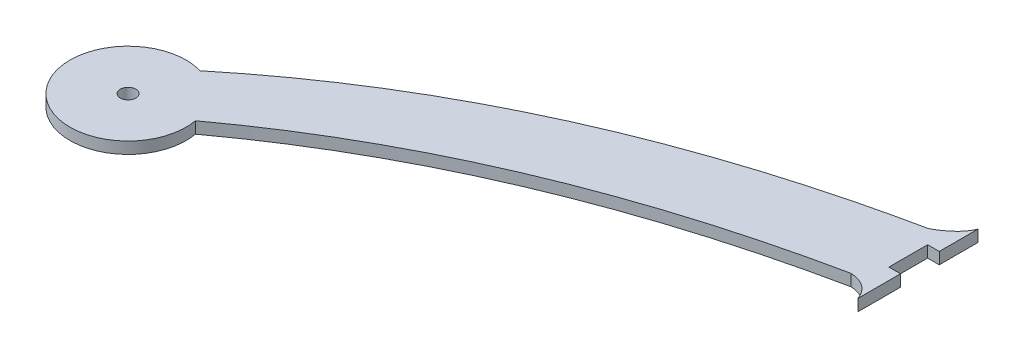
ISO-10303-21;
HEADER;
FILE_DESCRIPTION(('STEP AP214'),'2;1');
FILE_NAME('part.step','',(''),(''),'','','');
FILE_SCHEMA(('AUTOMOTIVE_DESIGN { 1 0 10303 214 1 1 1 1 }'));
ENDSEC;
DATA;
#1=APPLICATION_CONTEXT('core data for automotive mechanical design processes');
#2=APPLICATION_PROTOCOL_DEFINITION('international standard','automotive_design',2000,#1);
#3=PRODUCT_CONTEXT('',#1,'mechanical');
#4=PRODUCT('Part','Part','',(#3));
#5=PRODUCT_RELATED_PRODUCT_CATEGORY('part','',(#4));
#6=PRODUCT_DEFINITION_FORMATION('','',#4);
#7=PRODUCT_DEFINITION_CONTEXT('part definition',#1,'design');
#8=PRODUCT_DEFINITION('design','',#6,#7);
#9=PRODUCT_DEFINITION_SHAPE('','',#8);
#10=(LENGTH_UNIT() NAMED_UNIT(*) SI_UNIT(.MILLI.,.METRE.));
#11=(NAMED_UNIT(*) PLANE_ANGLE_UNIT() SI_UNIT($,.RADIAN.));
#12=(NAMED_UNIT(*) SI_UNIT($,.STERADIAN.) SOLID_ANGLE_UNIT());
#13=UNCERTAINTY_MEASURE_WITH_UNIT(LENGTH_MEASURE(1.E-05),#10,'distance_accuracy_value','');
#14=(GEOMETRIC_REPRESENTATION_CONTEXT(3) GLOBAL_UNCERTAINTY_ASSIGNED_CONTEXT((#13)) GLOBAL_UNIT_ASSIGNED_CONTEXT((#10,
#11,#12)) REPRESENTATION_CONTEXT('',''));
#15=CARTESIAN_POINT('',(0.,0.,0.));
#16=DIRECTION('',(0.,0.,1.));
#17=DIRECTION('',(1.,0.,0.));
#18=AXIS2_PLACEMENT_3D('',#15,#16,#17);
#19=CARTESIAN_POINT('',(-4.19999588779753,3.,-5.60000308414949));
#20=DIRECTION('',(0.,-1.,0.));
#21=DIRECTION('',(0.,0.,-1.));
#22=AXIS2_PLACEMENT_3D('',#19,#20,#21);
#23=CYLINDRICAL_SURFACE('',#22,15.);
#24=CARTESIAN_POINT('',(-4.19999588779753,0.,-5.60000308414949));
#25=DIRECTION('',(0.,1.,0.));
#26=DIRECTION('',(0.,0.,1.));
#27=AXIS2_PLACEMENT_3D('',#24,#25,#26);
#28=CIRCLE('',#27,15.);
#29=CARTESIAN_POINT('',(0.,0.,-20.0000042835412));
#30=VERTEX_POINT('',#29);
#31=CARTESIAN_POINT('',(10.567709202451,0.,-8.22962023640703));
#32=VERTEX_POINT('',#31);
#33=EDGE_CURVE('E230',#30,#32,#28,.T.);
#34=ORIENTED_EDGE('',*,*,#33,.T.);
#35=DIRECTION('',(0.,-1.,0.));
#36=VECTOR('',#35,1.);
#37=CARTESIAN_POINT('',(10.567709202451,3.,-8.22962023640703));
#38=LINE('',#37,#36);
#39=CARTESIAN_POINT('',(10.567709202451,3.,-8.22962023640703));
#40=VERTEX_POINT('',#39);
#41=EDGE_CURVE('E11',#40,#32,#38,.T.);
#42=ORIENTED_EDGE('',*,*,#41,.F.);
#43=CARTESIAN_POINT('',(-4.19999588779753,3.,-5.60000308414949));
#44=DIRECTION('',(0.,1.,0.));
#45=DIRECTION('',(0.,0.,1.));
#46=AXIS2_PLACEMENT_3D('',#43,#44,#45);
#47=CIRCLE('',#46,15.);
#48=CARTESIAN_POINT('',(0.,3.,-20.0000042835412));
#49=VERTEX_POINT('',#48);
#50=EDGE_CURVE('E265',#49,#40,#47,.T.);
#51=ORIENTED_EDGE('',*,*,#50,.F.);
#52=DIRECTION('',(0.,-1.,0.));
#53=VECTOR('',#52,1.);
#54=CARTESIAN_POINT('',(0.,3.,-20.0000042835412));
#55=LINE('',#54,#53);
#56=EDGE_CURVE('E54',#49,#30,#55,.T.);
#57=ORIENTED_EDGE('',*,*,#56,.T.);
#58=EDGE_LOOP('',(#34,#42,#51,#57));
#59=FACE_BOUND('',#58,.T.);
#60=ADVANCED_FACE('F38',(#59),#23,.T.);
#61=CARTESIAN_POINT('',(0.,3.,0.));
#62=CARTESIAN_POINT('',(34.5447985629627,3.,-28.4477275410358));
#63=CARTESIAN_POINT('',(77.6392976544481,3.,-48.0198460437819));
#64=CARTESIAN_POINT('',(129.28349989211,3.,-58.7163563899589));
#65=B_SPLINE_CURVE_WITH_KNOTS('',3,(#61,#62,#63,#64),.UNSPECIFIED.,.F.,.F.,(4,4),(0.,
0.960221944966108),.UNSPECIFIED.);
#66=DIRECTION('',(0.,-1.,0.));
#67=VECTOR('',#66,1.);
#68=SURFACE_OF_LINEAR_EXTRUSION('',#65,#67);
#69=CARTESIAN_POINT('',(0.,0.,0.));
#70=CARTESIAN_POINT('',(34.5447985629627,0.,-28.4477275410358));
#71=CARTESIAN_POINT('',(77.6392976544481,0.,-48.0198460437819));
#72=CARTESIAN_POINT('',(129.28349989211,0.,-58.7163563899589));
#73=B_SPLINE_CURVE_WITH_KNOTS('',3,(#69,#70,#71,#72),.UNSPECIFIED.,.F.,.F.,(4,4),(0.,
0.960221944966108),.UNSPECIFIED.);
#74=CARTESIAN_POINT('',(129.28349989211,0.,-58.7163563899589));
#75=VERTEX_POINT('',#74);
#76=EDGE_CURVE('E227',#32,#75,#73,.T.);
#77=ORIENTED_EDGE('',*,*,#76,.T.);
#78=DIRECTION('',(0.,-1.,0.));
#79=VECTOR('',#78,1.);
#80=CARTESIAN_POINT('',(129.28349989211,3.,-58.7163563899589));
#81=LINE('',#80,#79);
#82=CARTESIAN_POINT('',(129.28349989211,3.,-58.7163563899589));
#83=VERTEX_POINT('',#82);
#84=EDGE_CURVE('E46',#83,#75,#81,.T.);
#85=ORIENTED_EDGE('',*,*,#84,.F.);
#86=EDGE_CURVE('E99',#40,#83,#65,.T.);
#87=ORIENTED_EDGE('',*,*,#86,.F.);
#88=ORIENTED_EDGE('',*,*,#41,.T.);
#89=EDGE_LOOP('',(#77,#85,#87,#88));
#90=FACE_BOUND('',#89,.T.);
#91=ADVANCED_FACE('F183',(#90),#68,.F.);
#92=CARTESIAN_POINT('',(135.745739897631,3.,-54.));
#93=CARTESIAN_POINT('',(134.18841122333,3.,-58.3471546872006));
#94=CARTESIAN_POINT('',(129.28349989211,3.,-58.7163563899589));
#95=B_SPLINE_CURVE_WITH_KNOTS('',2,(#92,#93,#94),.UNSPECIFIED.,.F.,.F.,(3,3),(0.,1.),.UNSPECIFIED.);
#96=DIRECTION('',(0.,-1.,0.));
#97=VECTOR('',#96,1.);
#98=SURFACE_OF_LINEAR_EXTRUSION('',#95,#97);
#99=CARTESIAN_POINT('',(135.745739897631,0.,-54.));
#100=CARTESIAN_POINT('',(134.18841122333,0.,-58.3471546872006));
#101=CARTESIAN_POINT('',(129.28349989211,0.,-58.7163563899589));
#102=B_SPLINE_CURVE_WITH_KNOTS('',2,(#99,#100,#101),.UNSPECIFIED.,.F.,.F.,(3,3),(0.,1.),.UNSPECIFIED.);
#103=CARTESIAN_POINT('',(135.745739897631,0.,-54.));
#104=VERTEX_POINT('',#103);
#105=EDGE_CURVE('E224',#104,#75,#102,.T.);
#106=ORIENTED_EDGE('',*,*,#105,.F.);
#107=DIRECTION('',(0.,-1.,0.));
#108=VECTOR('',#107,1.);
#109=CARTESIAN_POINT('',(135.745739897631,3.,-54.));
#110=LINE('',#109,#108);
#111=CARTESIAN_POINT('',(135.745739897631,3.,-54.));
#112=VERTEX_POINT('',#111);
#113=EDGE_CURVE('E220',#112,#104,#110,.T.);
#114=ORIENTED_EDGE('',*,*,#113,.F.);
#115=EDGE_CURVE('E186',#112,#83,#95,.T.);
#116=ORIENTED_EDGE('',*,*,#115,.T.);
#117=ORIENTED_EDGE('',*,*,#84,.T.);
#118=EDGE_LOOP('',(#106,#114,#116,#117));
#119=FACE_BOUND('',#118,.T.);
#120=ADVANCED_FACE('F179',(#119),#98,.T.);
#121=CARTESIAN_POINT('',(135.745739897631,3.,0.));
#122=DIRECTION('',(1.,0.,0.));
#123=DIRECTION('',(0.,0.,-1.));
#124=AXIS2_PLACEMENT_3D('',#121,#122,#123);
#125=PLANE('',#124);
#126=DIRECTION('',(0.,0.,1.));
#127=VECTOR('',#126,1.);
#128=CARTESIAN_POINT('',(135.745739897631,0.,0.));
#129=LINE('',#128,#127);
#130=CARTESIAN_POINT('',(135.745739897631,0.,-65.));
#131=VERTEX_POINT('',#130);
#132=EDGE_CURVE('E235',#131,#104,#129,.T.);
#133=ORIENTED_EDGE('',*,*,#132,.F.);
#134=DIRECTION('',(0.,-1.,0.));
#135=VECTOR('',#134,1.);
#136=CARTESIAN_POINT('',(135.745739897631,3.,-65.));
#137=LINE('',#136,#135);
#138=CARTESIAN_POINT('',(135.745739897631,3.,-65.));
#139=VERTEX_POINT('',#138);
#140=EDGE_CURVE('E218',#139,#131,#137,.T.);
#141=ORIENTED_EDGE('',*,*,#140,.F.);
#142=DIRECTION('',(0.,0.,1.));
#143=VECTOR('',#142,1.);
#144=CARTESIAN_POINT('',(135.745739897631,3.,0.));
#145=LINE('',#144,#143);
#146=EDGE_CURVE('E192',#139,#112,#145,.T.);
#147=ORIENTED_EDGE('',*,*,#146,.T.);
#148=ORIENTED_EDGE('',*,*,#113,.T.);
#149=EDGE_LOOP('',(#133,#141,#147,#148));
#150=FACE_BOUND('',#149,.T.);
#151=ADVANCED_FACE('F175',(#150),#125,.T.);
#152=CARTESIAN_POINT('',(0.,3.,-65.));
#153=DIRECTION('',(0.,0.,-1.));
#154=DIRECTION('',(-1.,0.,0.));
#155=AXIS2_PLACEMENT_3D('',#152,#153,#154);
#156=PLANE('',#155);
#157=DIRECTION('',(1.,0.,0.));
#158=VECTOR('',#157,1.);
#159=CARTESIAN_POINT('',(0.,0.,-65.));
#160=LINE('',#159,#158);
#161=CARTESIAN_POINT('',(132.745739897631,0.,-65.));
#162=VERTEX_POINT('',#161);
#163=EDGE_CURVE('E237',#162,#131,#160,.T.);
#164=ORIENTED_EDGE('',*,*,#163,.F.);
#165=DIRECTION('',(0.,-1.,0.));
#166=VECTOR('',#165,1.);
#167=CARTESIAN_POINT('',(132.745739897631,3.,-65.));
#168=LINE('',#167,#166);
#169=CARTESIAN_POINT('',(132.745739897631,3.,-65.));
#170=VERTEX_POINT('',#169);
#171=EDGE_CURVE('E213',#170,#162,#168,.T.);
#172=ORIENTED_EDGE('',*,*,#171,.F.);
#173=DIRECTION('',(1.,0.,0.));
#174=VECTOR('',#173,1.);
#175=CARTESIAN_POINT('',(0.,3.,-65.));
#176=LINE('',#175,#174);
#177=EDGE_CURVE('E202',#170,#139,#176,.T.);
#178=ORIENTED_EDGE('',*,*,#177,.T.);
#179=ORIENTED_EDGE('',*,*,#140,.T.);
#180=EDGE_LOOP('',(#164,#172,#178,#179));
#181=FACE_BOUND('',#180,.T.);
#182=ADVANCED_FACE('F171',(#181),#156,.T.);
#183=CARTESIAN_POINT('',(132.745739897631,3.,0.));
#184=DIRECTION('',(1.,0.,0.));
#185=DIRECTION('',(0.,0.,-1.));
#186=AXIS2_PLACEMENT_3D('',#183,#184,#185);
#187=PLANE('',#186);
#188=DIRECTION('',(0.,0.,1.));
#189=VECTOR('',#188,1.);
#190=CARTESIAN_POINT('',(132.745739897631,0.,0.));
#191=LINE('',#190,#189);
#192=CARTESIAN_POINT('',(132.745739897631,0.,-75.));
#193=VERTEX_POINT('',#192);
#194=EDGE_CURVE('E248',#193,#162,#191,.T.);
#195=ORIENTED_EDGE('',*,*,#194,.F.);
#196=DIRECTION('',(0.,-1.,0.));
#197=VECTOR('',#196,1.);
#198=CARTESIAN_POINT('',(132.745739897631,3.,-75.));
#199=LINE('',#198,#197);
#200=CARTESIAN_POINT('',(132.745739897631,3.,-75.));
#201=VERTEX_POINT('',#200);
#202=EDGE_CURVE('E208',#201,#193,#199,.T.);
#203=ORIENTED_EDGE('',*,*,#202,.F.);
#204=DIRECTION('',(0.,0.,1.));
#205=VECTOR('',#204,1.);
#206=CARTESIAN_POINT('',(132.745739897631,3.,0.));
#207=LINE('',#206,#205);
#208=EDGE_CURVE('E205',#201,#170,#207,.T.);
#209=ORIENTED_EDGE('',*,*,#208,.T.);
#210=ORIENTED_EDGE('',*,*,#171,.T.);
#211=EDGE_LOOP('',(#195,#203,#209,#210));
#212=FACE_BOUND('',#211,.T.);
#213=ADVANCED_FACE('F167',(#212),#187,.T.);
#214=CARTESIAN_POINT('',(0.,3.,-75.));
#215=DIRECTION('',(0.,0.,1.));
#216=DIRECTION('',(1.,0.,0.));
#217=AXIS2_PLACEMENT_3D('',#214,#215,#216);
#218=PLANE('',#217);
#219=DIRECTION('',(-1.,0.,0.));
#220=VECTOR('',#219,1.);
#221=CARTESIAN_POINT('',(0.,0.,-75.));
#222=LINE('',#221,#220);
#223=CARTESIAN_POINT('',(135.745739897631,0.,-75.));
#224=VERTEX_POINT('',#223);
#225=EDGE_CURVE('E211',#224,#193,#222,.T.);
#226=ORIENTED_EDGE('',*,*,#225,.F.);
#227=DIRECTION('',(0.,-1.,0.));
#228=VECTOR('',#227,1.);
#229=CARTESIAN_POINT('',(135.745739897631,3.,-75.));
#230=LINE('',#229,#228);
#231=CARTESIAN_POINT('',(135.745739897631,3.,-75.));
#232=VERTEX_POINT('',#231);
#233=EDGE_CURVE('E139',#232,#224,#230,.T.);
#234=ORIENTED_EDGE('',*,*,#233,.F.);
#235=DIRECTION('',(-1.,0.,0.));
#236=VECTOR('',#235,1.);
#237=CARTESIAN_POINT('',(0.,3.,-75.));
#238=LINE('',#237,#236);
#239=EDGE_CURVE('E129',#232,#201,#238,.T.);
#240=ORIENTED_EDGE('',*,*,#239,.T.);
#241=ORIENTED_EDGE('',*,*,#202,.T.);
#242=EDGE_LOOP('',(#226,#234,#240,#241));
#243=FACE_BOUND('',#242,.T.);
#244=ADVANCED_FACE('F164',(#243),#218,.T.);
#245=CARTESIAN_POINT('',(135.745739897631,3.,0.));
#246=DIRECTION('',(-1.,0.,0.));
#247=DIRECTION('',(0.,0.,1.));
#248=AXIS2_PLACEMENT_3D('',#245,#246,#247);
#249=PLANE('',#248);
#250=DIRECTION('',(0.,0.,-1.));
#251=VECTOR('',#250,1.);
#252=CARTESIAN_POINT('',(135.745739897631,0.,0.));
#253=LINE('',#252,#251);
#254=CARTESIAN_POINT('',(135.745739897631,0.,-85.));
#255=VERTEX_POINT('',#254);
#256=EDGE_CURVE('E136',#224,#255,#253,.T.);
#257=ORIENTED_EDGE('',*,*,#256,.T.);
#258=DIRECTION('',(0.,-1.,0.));
#259=VECTOR('',#258,1.);
#260=CARTESIAN_POINT('',(135.745739897631,3.,-85.));
#261=LINE('',#260,#259);
#262=CARTESIAN_POINT('',(135.745739897631,3.,-85.));
#263=VERTEX_POINT('',#262);
#264=EDGE_CURVE('E133',#263,#255,#261,.T.);
#265=ORIENTED_EDGE('',*,*,#264,.F.);
#266=DIRECTION('',(0.,0.,-1.));
#267=VECTOR('',#266,1.);
#268=CARTESIAN_POINT('',(135.745739897631,3.,0.));
#269=LINE('',#268,#267);
#270=EDGE_CURVE('E121',#232,#263,#269,.T.);
#271=ORIENTED_EDGE('',*,*,#270,.F.);
#272=ORIENTED_EDGE('',*,*,#233,.T.);
#273=EDGE_LOOP('',(#257,#265,#271,#272));
#274=FACE_BOUND('',#273,.T.);
#275=ADVANCED_FACE('F134',(#274),#249,.F.);
#276=CARTESIAN_POINT('',(135.745739897631,3.,-85.));
#277=CARTESIAN_POINT('',(134.392955153577,3.,-81.5429285921417));
#278=CARTESIAN_POINT('',(129.283499131438,3.,-78.7163563477869));
#279=B_SPLINE_CURVE_WITH_KNOTS('',2,(#276,#277,#278),.UNSPECIFIED.,.F.,.F.,(3,3),(0.,1.),.UNSPECIFIED.);
#280=DIRECTION('',(0.,-1.,0.));
#281=VECTOR('',#280,1.);
#282=SURFACE_OF_LINEAR_EXTRUSION('',#279,#281);
#283=CARTESIAN_POINT('',(135.745739897631,0.,-85.));
#284=CARTESIAN_POINT('',(134.392955153577,0.,-81.5429285921417));
#285=CARTESIAN_POINT('',(129.283499131438,0.,-78.7163563477869));
#286=B_SPLINE_CURVE_WITH_KNOTS('',2,(#283,#284,#285),.UNSPECIFIED.,.F.,.F.,(3,3),(0.,1.),.UNSPECIFIED.);
#287=CARTESIAN_POINT('',(129.283499131438,0.,-78.7163563477869));
#288=VERTEX_POINT('',#287);
#289=EDGE_CURVE('E253',#255,#288,#286,.T.);
#290=ORIENTED_EDGE('',*,*,#289,.T.);
#291=DIRECTION('',(0.,-1.,0.));
#292=VECTOR('',#291,1.);
#293=CARTESIAN_POINT('',(129.283499131438,3.,-78.7163563477869));
#294=LINE('',#293,#292);
#295=CARTESIAN_POINT('',(129.283499131438,3.,-78.7163563477869));
#296=VERTEX_POINT('',#295);
#297=EDGE_CURVE('E87',#296,#288,#294,.T.);
#298=ORIENTED_EDGE('',*,*,#297,.F.);
#299=EDGE_CURVE('E126',#263,#296,#279,.T.);
#300=ORIENTED_EDGE('',*,*,#299,.F.);
#301=ORIENTED_EDGE('',*,*,#264,.T.);
#302=EDGE_LOOP('',(#290,#298,#300,#301));
#303=FACE_BOUND('',#302,.T.);
#304=ADVANCED_FACE('F141',(#303),#282,.F.);
#305=CARTESIAN_POINT('',(0.,3.,-20.0000042835412));
#306=CARTESIAN_POINT('',(34.5447985325934,3.,-48.4477317995679));
#307=CARTESIAN_POINT('',(77.6392969542107,3.,-68.0198486284327));
#308=CARTESIAN_POINT('',(129.283499131438,3.,-78.7163563477869));
#309=B_SPLINE_CURVE_WITH_KNOTS('',3,(#305,#306,#307,#308),.UNSPECIFIED.,.F.,.F.,(4,4),(0.,
0.960221944121951),.UNSPECIFIED.);
#310=DIRECTION('',(0.,-1.,0.));
#311=VECTOR('',#310,1.);
#312=SURFACE_OF_LINEAR_EXTRUSION('',#309,#311);
#313=CARTESIAN_POINT('',(0.,0.,-20.0000042835412));
#314=CARTESIAN_POINT('',(34.5447985325934,0.,-48.4477317995679));
#315=CARTESIAN_POINT('',(77.6392969542107,0.,-68.0198486284327));
#316=CARTESIAN_POINT('',(129.283499131438,0.,-78.7163563477869));
#317=B_SPLINE_CURVE_WITH_KNOTS('',3,(#313,#314,#315,#316),.UNSPECIFIED.,.F.,.F.,(4,4),(0.,
0.960221944121951),.UNSPECIFIED.);
#318=EDGE_CURVE('E257',#30,#288,#317,.T.);
#319=ORIENTED_EDGE('',*,*,#318,.F.);
#320=ORIENTED_EDGE('',*,*,#56,.F.);
#321=EDGE_CURVE('E142',#49,#296,#309,.T.);
#322=ORIENTED_EDGE('',*,*,#321,.T.);
#323=ORIENTED_EDGE('',*,*,#297,.T.);
#324=EDGE_LOOP('',(#319,#320,#322,#323));
#325=FACE_BOUND('',#324,.T.);
#326=ADVANCED_FACE('F160',(#325),#312,.T.);
#327=CARTESIAN_POINT('',(0.,3.,0.));
#328=DIRECTION('',(0.,1.,0.));
#329=DIRECTION('',(0.,0.,1.));
#330=AXIS2_PLACEMENT_3D('',#327,#328,#329);
#331=PLANE('',#330);
#332=CARTESIAN_POINT('',(-4.19999588779753,3.,-5.60000308414949));
#333=DIRECTION('',(0.,1.,0.));
#334=DIRECTION('',(0.,0.,1.));
#335=AXIS2_PLACEMENT_3D('',#332,#333,#334);
#336=CIRCLE('',#335,2.);
#337=CARTESIAN_POINT('',(-4.19999588779753,3.,-3.60000308414949));
#338=VERTEX_POINT('',#337);
#339=EDGE_CURVE('E270',#338,#338,#336,.T.);
#340=ORIENTED_EDGE('',*,*,#339,.F.);
#341=EDGE_LOOP('',(#340));
#342=FACE_BOUND('',#341,.T.);
#343=ORIENTED_EDGE('',*,*,#50,.T.);
#344=ORIENTED_EDGE('',*,*,#86,.T.);
#345=ORIENTED_EDGE('',*,*,#115,.F.);
#346=ORIENTED_EDGE('',*,*,#146,.F.);
#347=ORIENTED_EDGE('',*,*,#177,.F.);
#348=ORIENTED_EDGE('',*,*,#208,.F.);
#349=ORIENTED_EDGE('',*,*,#239,.F.);
#350=ORIENTED_EDGE('',*,*,#270,.T.);
#351=ORIENTED_EDGE('',*,*,#299,.T.);
#352=ORIENTED_EDGE('',*,*,#321,.F.);
#353=EDGE_LOOP('',(#343,#344,#345,#346,#347,#348,#349,#350,#351,#352));
#354=FACE_BOUND('',#353,.T.);
#355=ADVANCED_FACE('F123',(#342,#354),#331,.T.);
#356=CARTESIAN_POINT('',(0.,0.,0.));
#357=DIRECTION('',(0.,1.,0.));
#358=DIRECTION('',(0.,0.,1.));
#359=AXIS2_PLACEMENT_3D('',#356,#357,#358);
#360=PLANE('',#359);
#361=CARTESIAN_POINT('',(-4.19999588779753,0.,-5.60000308414949));
#362=DIRECTION('',(0.,1.,0.));
#363=DIRECTION('',(0.,0.,1.));
#364=AXIS2_PLACEMENT_3D('',#361,#362,#363);
#365=CIRCLE('',#364,2.);
#366=CARTESIAN_POINT('',(-4.19999588779753,0.,-3.60000308414949));
#367=VERTEX_POINT('',#366);
#368=EDGE_CURVE('E273',#367,#367,#365,.T.);
#369=ORIENTED_EDGE('',*,*,#368,.T.);
#370=EDGE_LOOP('',(#369));
#371=FACE_BOUND('',#370,.T.);
#372=ORIENTED_EDGE('',*,*,#33,.F.);
#373=ORIENTED_EDGE('',*,*,#318,.T.);
#374=ORIENTED_EDGE('',*,*,#289,.F.);
#375=ORIENTED_EDGE('',*,*,#256,.F.);
#376=ORIENTED_EDGE('',*,*,#225,.T.);
#377=ORIENTED_EDGE('',*,*,#194,.T.);
#378=ORIENTED_EDGE('',*,*,#163,.T.);
#379=ORIENTED_EDGE('',*,*,#132,.T.);
#380=ORIENTED_EDGE('',*,*,#105,.T.);
#381=ORIENTED_EDGE('',*,*,#76,.F.);
#382=EDGE_LOOP('',(#372,#373,#374,#375,#376,#377,#378,#379,#380,#381));
#383=FACE_BOUND('',#382,.T.);
#384=ADVANCED_FACE('F232',(#371,#383),#360,.F.);
#385=CARTESIAN_POINT('',(-4.19999588779753,0.,-5.60000308414949));
#386=DIRECTION('',(0.,1.,0.));
#387=DIRECTION('',(0.,0.,1.));
#388=AXIS2_PLACEMENT_3D('',#385,#386,#387);
#389=CYLINDRICAL_SURFACE('',#388,2.);
#390=ORIENTED_EDGE('',*,*,#368,.F.);
#391=EDGE_LOOP('',(#390));
#392=FACE_BOUND('',#391,.T.);
#393=ORIENTED_EDGE('',*,*,#339,.T.);
#394=EDGE_LOOP('',(#393));
#395=FACE_BOUND('',#394,.T.);
#396=ADVANCED_FACE('F339',(#392,#395),#389,.F.);
#397=CLOSED_SHELL('',(#60,#91,#120,#151,#182,#213,#244,#275,#304,#326,#355,#384,#396));
#398=MANIFOLD_SOLID_BREP('B2',#397);
#399=ADVANCED_BREP_SHAPE_REPRESENTATION('',(#18,#398),#14);
#400=SHAPE_DEFINITION_REPRESENTATION(#9,#399);
ENDSEC;
END-ISO-10303-21;
